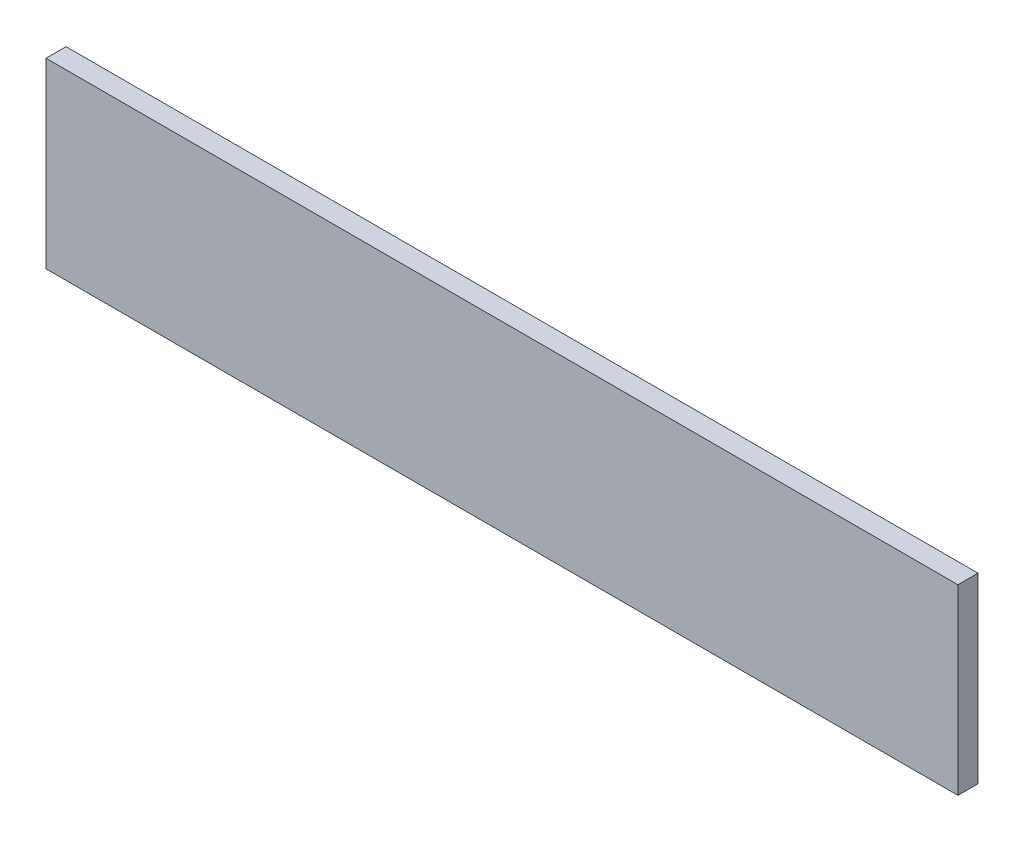
ISO-10303-21;
HEADER;
FILE_DESCRIPTION(('STEP AP214'),'2;1');
FILE_NAME('part.step','',(''),(''),'','','');
FILE_SCHEMA(('AUTOMOTIVE_DESIGN { 1 0 10303 214 1 1 1 1 }'));
ENDSEC;
DATA;
#1=APPLICATION_CONTEXT('core data for automotive mechanical design processes');
#2=APPLICATION_PROTOCOL_DEFINITION('international standard','automotive_design',2000,#1);
#3=PRODUCT_CONTEXT('',#1,'mechanical');
#4=PRODUCT('Part','Part','',(#3));
#5=PRODUCT_RELATED_PRODUCT_CATEGORY('part','',(#4));
#6=PRODUCT_DEFINITION_FORMATION('','',#4);
#7=PRODUCT_DEFINITION_CONTEXT('part definition',#1,'design');
#8=PRODUCT_DEFINITION('design','',#6,#7);
#9=PRODUCT_DEFINITION_SHAPE('','',#8);
#10=(LENGTH_UNIT() NAMED_UNIT(*) SI_UNIT(.MILLI.,.METRE.));
#11=(NAMED_UNIT(*) PLANE_ANGLE_UNIT() SI_UNIT($,.RADIAN.));
#12=(NAMED_UNIT(*) SI_UNIT($,.STERADIAN.) SOLID_ANGLE_UNIT());
#13=UNCERTAINTY_MEASURE_WITH_UNIT(LENGTH_MEASURE(1.E-05),#10,'distance_accuracy_value','');
#14=(GEOMETRIC_REPRESENTATION_CONTEXT(3) GLOBAL_UNCERTAINTY_ASSIGNED_CONTEXT((#13)) GLOBAL_UNIT_ASSIGNED_CONTEXT((#10,
#11,#12)) REPRESENTATION_CONTEXT('',''));
#15=CARTESIAN_POINT('',(0.,0.,0.));
#16=DIRECTION('',(0.,0.,1.));
#17=DIRECTION('',(1.,0.,0.));
#18=AXIS2_PLACEMENT_3D('',#15,#16,#17);
#19=CARTESIAN_POINT('',(-500.,100.,22.));
#20=DIRECTION('',(1.,0.,0.));
#21=DIRECTION('',(0.,0.,-1.));
#22=AXIS2_PLACEMENT_3D('',#19,#20,#21);
#23=PLANE('',#22);
#24=DIRECTION('',(0.,-1.,0.));
#25=VECTOR('',#24,1.);
#26=CARTESIAN_POINT('',(-500.,100.,0.));
#27=LINE('',#26,#25);
#28=CARTESIAN_POINT('',(-500.,100.,0.));
#29=VERTEX_POINT('',#28);
#30=CARTESIAN_POINT('',(-500.,-100.,0.));
#31=VERTEX_POINT('',#30);
#32=EDGE_CURVE('E96',#29,#31,#27,.T.);
#33=ORIENTED_EDGE('',*,*,#32,.T.);
#34=DIRECTION('',(0.,0.,-1.));
#35=VECTOR('',#34,1.);
#36=CARTESIAN_POINT('',(-500.,-100.,22.));
#37=LINE('',#36,#35);
#38=CARTESIAN_POINT('',(-500.,-100.,22.));
#39=VERTEX_POINT('',#38);
#40=EDGE_CURVE('E11',#39,#31,#37,.T.);
#41=ORIENTED_EDGE('',*,*,#40,.F.);
#42=DIRECTION('',(0.,-1.,0.));
#43=VECTOR('',#42,1.);
#44=CARTESIAN_POINT('',(-500.,100.,22.));
#45=LINE('',#44,#43);
#46=CARTESIAN_POINT('',(-500.,100.,22.));
#47=VERTEX_POINT('',#46);
#48=EDGE_CURVE('E84',#47,#39,#45,.T.);
#49=ORIENTED_EDGE('',*,*,#48,.F.);
#50=DIRECTION('',(0.,0.,-1.));
#51=VECTOR('',#50,1.);
#52=CARTESIAN_POINT('',(-500.,100.,22.));
#53=LINE('',#52,#51);
#54=EDGE_CURVE('E92',#47,#29,#53,.T.);
#55=ORIENTED_EDGE('',*,*,#54,.T.);
#56=EDGE_LOOP('',(#33,#41,#49,#55));
#57=FACE_BOUND('',#56,.T.);
#58=ADVANCED_FACE('F33',(#57),#23,.F.);
#59=CARTESIAN_POINT('',(-500.,-100.,22.));
#60=DIRECTION('',(0.,1.,0.));
#61=DIRECTION('',(0.,0.,1.));
#62=AXIS2_PLACEMENT_3D('',#59,#60,#61);
#63=PLANE('',#62);
#64=DIRECTION('',(1.,0.,0.));
#65=VECTOR('',#64,1.);
#66=CARTESIAN_POINT('',(-500.,-100.,0.));
#67=LINE('',#66,#65);
#68=CARTESIAN_POINT('',(500.,-100.,0.));
#69=VERTEX_POINT('',#68);
#70=EDGE_CURVE('E88',#31,#69,#67,.T.);
#71=ORIENTED_EDGE('',*,*,#70,.T.);
#72=DIRECTION('',(0.,0.,-1.));
#73=VECTOR('',#72,1.);
#74=CARTESIAN_POINT('',(500.,-100.,22.));
#75=LINE('',#74,#73);
#76=CARTESIAN_POINT('',(500.,-100.,22.));
#77=VERTEX_POINT('',#76);
#78=EDGE_CURVE('E41',#77,#69,#75,.T.);
#79=ORIENTED_EDGE('',*,*,#78,.F.);
#80=DIRECTION('',(1.,0.,0.));
#81=VECTOR('',#80,1.);
#82=CARTESIAN_POINT('',(-500.,-100.,22.));
#83=LINE('',#82,#81);
#84=EDGE_CURVE('E79',#39,#77,#83,.T.);
#85=ORIENTED_EDGE('',*,*,#84,.F.);
#86=ORIENTED_EDGE('',*,*,#40,.T.);
#87=EDGE_LOOP('',(#71,#79,#85,#86));
#88=FACE_BOUND('',#87,.T.);
#89=ADVANCED_FACE('F87',(#88),#63,.F.);
#90=CARTESIAN_POINT('',(500.,-100.,22.));
#91=DIRECTION('',(-1.,0.,0.));
#92=DIRECTION('',(0.,0.,1.));
#93=AXIS2_PLACEMENT_3D('',#90,#91,#92);
#94=PLANE('',#93);
#95=DIRECTION('',(0.,1.,0.));
#96=VECTOR('',#95,1.);
#97=CARTESIAN_POINT('',(500.,-100.,0.));
#98=LINE('',#97,#96);
#99=CARTESIAN_POINT('',(500.,100.,0.));
#100=VERTEX_POINT('',#99);
#101=EDGE_CURVE('E66',#69,#100,#98,.T.);
#102=ORIENTED_EDGE('',*,*,#101,.T.);
#103=DIRECTION('',(0.,0.,-1.));
#104=VECTOR('',#103,1.);
#105=CARTESIAN_POINT('',(500.,100.,22.));
#106=LINE('',#105,#104);
#107=CARTESIAN_POINT('',(500.,100.,22.));
#108=VERTEX_POINT('',#107);
#109=EDGE_CURVE('E89',#108,#100,#106,.T.);
#110=ORIENTED_EDGE('',*,*,#109,.F.);
#111=DIRECTION('',(0.,1.,0.));
#112=VECTOR('',#111,1.);
#113=CARTESIAN_POINT('',(500.,-100.,22.));
#114=LINE('',#113,#112);
#115=EDGE_CURVE('E82',#77,#108,#114,.T.);
#116=ORIENTED_EDGE('',*,*,#115,.F.);
#117=ORIENTED_EDGE('',*,*,#78,.T.);
#118=EDGE_LOOP('',(#102,#110,#116,#117));
#119=FACE_BOUND('',#118,.T.);
#120=ADVANCED_FACE('F90',(#119),#94,.F.);
#121=CARTESIAN_POINT('',(500.,100.,22.));
#122=DIRECTION('',(0.,-1.,0.));
#123=DIRECTION('',(0.,0.,-1.));
#124=AXIS2_PLACEMENT_3D('',#121,#122,#123);
#125=PLANE('',#124);
#126=DIRECTION('',(-1.,0.,0.));
#127=VECTOR('',#126,1.);
#128=CARTESIAN_POINT('',(500.,100.,0.));
#129=LINE('',#128,#127);
#130=EDGE_CURVE('E72',#100,#29,#129,.T.);
#131=ORIENTED_EDGE('',*,*,#130,.T.);
#132=ORIENTED_EDGE('',*,*,#54,.F.);
#133=DIRECTION('',(-1.,0.,0.));
#134=VECTOR('',#133,1.);
#135=CARTESIAN_POINT('',(500.,100.,22.));
#136=LINE('',#135,#134);
#137=EDGE_CURVE('E49',#108,#47,#136,.T.);
#138=ORIENTED_EDGE('',*,*,#137,.F.);
#139=ORIENTED_EDGE('',*,*,#109,.T.);
#140=EDGE_LOOP('',(#131,#132,#138,#139));
#141=FACE_BOUND('',#140,.T.);
#142=ADVANCED_FACE('F103',(#141),#125,.F.);
#143=CARTESIAN_POINT('',(0.,0.,22.));
#144=DIRECTION('',(0.,0.,1.));
#145=DIRECTION('',(1.,0.,0.));
#146=AXIS2_PLACEMENT_3D('',#143,#144,#145);
#147=PLANE('',#146);
#148=ORIENTED_EDGE('',*,*,#48,.T.);
#149=ORIENTED_EDGE('',*,*,#84,.T.);
#150=ORIENTED_EDGE('',*,*,#115,.T.);
#151=ORIENTED_EDGE('',*,*,#137,.T.);
#152=EDGE_LOOP('',(#148,#149,#150,#151));
#153=FACE_BOUND('',#152,.T.);
#154=ADVANCED_FACE('F80',(#153),#147,.T.);
#155=CARTESIAN_POINT('',(0.,0.,0.));
#156=DIRECTION('',(0.,0.,1.));
#157=DIRECTION('',(1.,0.,0.));
#158=AXIS2_PLACEMENT_3D('',#155,#156,#157);
#159=PLANE('',#158);
#160=ORIENTED_EDGE('',*,*,#32,.F.);
#161=ORIENTED_EDGE('',*,*,#130,.F.);
#162=ORIENTED_EDGE('',*,*,#101,.F.);
#163=ORIENTED_EDGE('',*,*,#70,.F.);
#164=EDGE_LOOP('',(#160,#161,#162,#163));
#165=FACE_BOUND('',#164,.T.);
#166=ADVANCED_FACE('F106',(#165),#159,.F.);
#167=CLOSED_SHELL('',(#58,#89,#120,#142,#154,#166));
#168=MANIFOLD_SOLID_BREP('B2',#167);
#169=ADVANCED_BREP_SHAPE_REPRESENTATION('',(#18,#168),#14);
#170=SHAPE_DEFINITION_REPRESENTATION(#9,#169);
ENDSEC;
END-ISO-10303-21;
